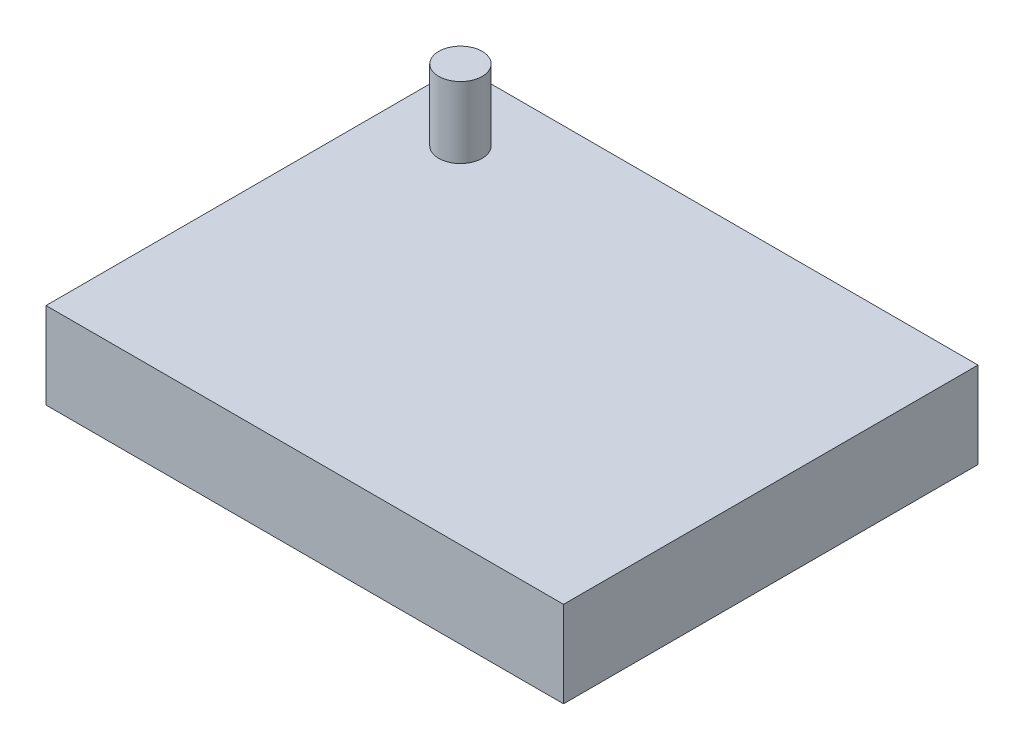
ISO-10303-21;
HEADER;
FILE_DESCRIPTION(('STEP AP214'),'2;1');
FILE_NAME('part.step','',(''),(''),'','','');
FILE_SCHEMA(('AUTOMOTIVE_DESIGN { 1 0 10303 214 1 1 1 1 }'));
ENDSEC;
DATA;
#1=APPLICATION_CONTEXT('core data for automotive mechanical design processes');
#2=APPLICATION_PROTOCOL_DEFINITION('international standard','automotive_design',2000,#1);
#3=PRODUCT_CONTEXT('',#1,'mechanical');
#4=PRODUCT('Part','Part','',(#3));
#5=PRODUCT_RELATED_PRODUCT_CATEGORY('part','',(#4));
#6=PRODUCT_DEFINITION_FORMATION('','',#4);
#7=PRODUCT_DEFINITION_CONTEXT('part definition',#1,'design');
#8=PRODUCT_DEFINITION('design','',#6,#7);
#9=PRODUCT_DEFINITION_SHAPE('','',#8);
#10=(LENGTH_UNIT() NAMED_UNIT(*) SI_UNIT(.MILLI.,.METRE.));
#11=(NAMED_UNIT(*) PLANE_ANGLE_UNIT() SI_UNIT($,.RADIAN.));
#12=(NAMED_UNIT(*) SI_UNIT($,.STERADIAN.) SOLID_ANGLE_UNIT());
#13=UNCERTAINTY_MEASURE_WITH_UNIT(LENGTH_MEASURE(1.E-05),#10,'distance_accuracy_value','');
#14=(GEOMETRIC_REPRESENTATION_CONTEXT(3) GLOBAL_UNCERTAINTY_ASSIGNED_CONTEXT((#13)) GLOBAL_UNIT_ASSIGNED_CONTEXT((#10,
#11,#12)) REPRESENTATION_CONTEXT('',''));
#15=CARTESIAN_POINT('',(0.,0.,0.));
#16=DIRECTION('',(0.,0.,1.));
#17=DIRECTION('',(1.,0.,0.));
#18=AXIS2_PLACEMENT_3D('',#15,#16,#17);
#19=CARTESIAN_POINT('',(-95.3184759122075,31.75,76.3302112377938));
#20=DIRECTION('',(1.,0.,0.));
#21=DIRECTION('',(0.,0.,-1.));
#22=AXIS2_PLACEMENT_3D('',#19,#20,#21);
#23=PLANE('',#22);
#24=DIRECTION('',(0.,0.,1.));
#25=VECTOR('',#24,1.);
#26=CARTESIAN_POINT('',(-95.3184759122075,0.,76.3302112377938));
#27=LINE('',#26,#25);
#28=CARTESIAN_POINT('',(-95.3184759122075,0.,-76.3302112377938));
#29=VERTEX_POINT('',#28);
#30=CARTESIAN_POINT('',(-95.3184759122075,0.,76.3302112377938));
#31=VERTEX_POINT('',#30);
#32=EDGE_CURVE('E103',#29,#31,#27,.T.);
#33=ORIENTED_EDGE('',*,*,#32,.T.);
#34=DIRECTION('',(0.,-1.,0.));
#35=VECTOR('',#34,1.);
#36=CARTESIAN_POINT('',(-95.3184759122075,31.75,76.3302112377938));
#37=LINE('',#36,#35);
#38=CARTESIAN_POINT('',(-95.3184759122075,31.75,76.3302112377938));
#39=VERTEX_POINT('',#38);
#40=EDGE_CURVE('E45',#39,#31,#37,.T.);
#41=ORIENTED_EDGE('',*,*,#40,.F.);
#42=DIRECTION('',(0.,0.,1.));
#43=VECTOR('',#42,1.);
#44=CARTESIAN_POINT('',(-95.3184759122075,31.75,76.3302112377938));
#45=LINE('',#44,#43);
#46=CARTESIAN_POINT('',(-95.3184759122075,31.75,-76.3302112377938));
#47=VERTEX_POINT('',#46);
#48=EDGE_CURVE('E89',#47,#39,#45,.T.);
#49=ORIENTED_EDGE('',*,*,#48,.F.);
#50=DIRECTION('',(0.,-1.,0.));
#51=VECTOR('',#50,1.);
#52=CARTESIAN_POINT('',(-95.3184759122075,31.75,-76.3302112377938));
#53=LINE('',#52,#51);
#54=EDGE_CURVE('E99',#47,#29,#53,.T.);
#55=ORIENTED_EDGE('',*,*,#54,.T.);
#56=EDGE_LOOP('',(#33,#41,#49,#55));
#57=FACE_BOUND('',#56,.T.);
#58=ADVANCED_FACE('F37',(#57),#23,.F.);
#59=CARTESIAN_POINT('',(-95.3184759122075,31.75,76.3302112377938));
#60=DIRECTION('',(0.,0.,-1.));
#61=DIRECTION('',(-1.,0.,0.));
#62=AXIS2_PLACEMENT_3D('',#59,#60,#61);
#63=PLANE('',#62);
#64=DIRECTION('',(1.,0.,0.));
#65=VECTOR('',#64,1.);
#66=CARTESIAN_POINT('',(-95.3184759122075,0.,76.3302112377938));
#67=LINE('',#66,#65);
#68=CARTESIAN_POINT('',(95.3184759122075,0.,76.3302112377938));
#69=VERTEX_POINT('',#68);
#70=EDGE_CURVE('E94',#31,#69,#67,.T.);
#71=ORIENTED_EDGE('',*,*,#70,.T.);
#72=DIRECTION('',(0.,-1.,0.));
#73=VECTOR('',#72,1.);
#74=CARTESIAN_POINT('',(95.3184759122075,31.75,76.3302112377938));
#75=LINE('',#74,#73);
#76=CARTESIAN_POINT('',(95.3184759122075,31.75,76.3302112377938));
#77=VERTEX_POINT('',#76);
#78=EDGE_CURVE('E92',#77,#69,#75,.T.);
#79=ORIENTED_EDGE('',*,*,#78,.F.);
#80=DIRECTION('',(1.,0.,0.));
#81=VECTOR('',#80,1.);
#82=CARTESIAN_POINT('',(-95.3184759122075,31.75,76.3302112377938));
#83=LINE('',#82,#81);
#84=EDGE_CURVE('E84',#39,#77,#83,.T.);
#85=ORIENTED_EDGE('',*,*,#84,.F.);
#86=ORIENTED_EDGE('',*,*,#40,.T.);
#87=EDGE_LOOP('',(#71,#79,#85,#86));
#88=FACE_BOUND('',#87,.T.);
#89=ADVANCED_FACE('F93',(#88),#63,.F.);
#90=CARTESIAN_POINT('',(95.3184759122075,31.75,76.3302112377938));
#91=DIRECTION('',(-1.,0.,0.));
#92=DIRECTION('',(0.,0.,1.));
#93=AXIS2_PLACEMENT_3D('',#90,#91,#92);
#94=PLANE('',#93);
#95=DIRECTION('',(0.,0.,-1.));
#96=VECTOR('',#95,1.);
#97=CARTESIAN_POINT('',(95.3184759122075,0.,76.3302112377938));
#98=LINE('',#97,#96);
#99=CARTESIAN_POINT('',(95.3184759122075,0.,-76.3302112377938));
#100=VERTEX_POINT('',#99);
#101=EDGE_CURVE('E70',#69,#100,#98,.T.);
#102=ORIENTED_EDGE('',*,*,#101,.T.);
#103=DIRECTION('',(0.,-1.,0.));
#104=VECTOR('',#103,1.);
#105=CARTESIAN_POINT('',(95.3184759122075,31.75,-76.3302112377938));
#106=LINE('',#105,#104);
#107=CARTESIAN_POINT('',(95.3184759122075,31.75,-76.3302112377938));
#108=VERTEX_POINT('',#107);
#109=EDGE_CURVE('E95',#108,#100,#106,.T.);
#110=ORIENTED_EDGE('',*,*,#109,.F.);
#111=DIRECTION('',(0.,0.,-1.));
#112=VECTOR('',#111,1.);
#113=CARTESIAN_POINT('',(95.3184759122075,31.75,76.3302112377938));
#114=LINE('',#113,#112);
#115=EDGE_CURVE('E87',#77,#108,#114,.T.);
#116=ORIENTED_EDGE('',*,*,#115,.F.);
#117=ORIENTED_EDGE('',*,*,#78,.T.);
#118=EDGE_LOOP('',(#102,#110,#116,#117));
#119=FACE_BOUND('',#118,.T.);
#120=ADVANCED_FACE('F97',(#119),#94,.F.);
#121=CARTESIAN_POINT('',(-95.3184759122075,31.75,-76.3302112377938));
#122=DIRECTION('',(0.,0.,1.));
#123=DIRECTION('',(1.,0.,0.));
#124=AXIS2_PLACEMENT_3D('',#121,#122,#123);
#125=PLANE('',#124);
#126=DIRECTION('',(-1.,0.,0.));
#127=VECTOR('',#126,1.);
#128=CARTESIAN_POINT('',(-95.3184759122075,0.,-76.3302112377938));
#129=LINE('',#128,#127);
#130=EDGE_CURVE('E76',#100,#29,#129,.T.);
#131=ORIENTED_EDGE('',*,*,#130,.T.);
#132=ORIENTED_EDGE('',*,*,#54,.F.);
#133=DIRECTION('',(-1.,0.,0.));
#134=VECTOR('',#133,1.);
#135=CARTESIAN_POINT('',(-95.3184759122075,31.75,-76.3302112377938));
#136=LINE('',#135,#134);
#137=EDGE_CURVE('E53',#108,#47,#136,.T.);
#138=ORIENTED_EDGE('',*,*,#137,.F.);
#139=ORIENTED_EDGE('',*,*,#109,.T.);
#140=EDGE_LOOP('',(#131,#132,#138,#139));
#141=FACE_BOUND('',#140,.T.);
#142=ADVANCED_FACE('F125',(#141),#125,.F.);
#143=CARTESIAN_POINT('',(0.,31.75,0.));
#144=DIRECTION('',(0.,-1.,0.));
#145=DIRECTION('',(0.,0.,-1.));
#146=AXIS2_PLACEMENT_3D('',#143,#144,#145);
#147=PLANE('',#146);
#148=CARTESIAN_POINT('',(-69.9184759122075,31.75,-50.9302112377938));
#149=DIRECTION('',(0.,-1.,0.));
#150=DIRECTION('',(0.,0.,-1.));
#151=AXIS2_PLACEMENT_3D('',#148,#149,#150);
#152=CIRCLE('',#151,8.001);
#153=CARTESIAN_POINT('',(-69.9184759122075,31.75,-58.9312112377939));
#154=VERTEX_POINT('',#153);
#155=EDGE_CURVE('E11',#154,#154,#152,.F.);
#156=ORIENTED_EDGE('',*,*,#155,.F.);
#157=EDGE_LOOP('',(#156));
#158=FACE_BOUND('',#157,.T.);
#159=ORIENTED_EDGE('',*,*,#48,.T.);
#160=ORIENTED_EDGE('',*,*,#84,.T.);
#161=ORIENTED_EDGE('',*,*,#115,.T.);
#162=ORIENTED_EDGE('',*,*,#137,.T.);
#163=EDGE_LOOP('',(#159,#160,#161,#162));
#164=FACE_BOUND('',#163,.T.);
#165=ADVANCED_FACE('F85',(#158,#164),#147,.F.);
#166=CARTESIAN_POINT('',(0.,0.,0.));
#167=DIRECTION('',(0.,-1.,0.));
#168=DIRECTION('',(0.,0.,-1.));
#169=AXIS2_PLACEMENT_3D('',#166,#167,#168);
#170=PLANE('',#169);
#171=ORIENTED_EDGE('',*,*,#32,.F.);
#172=ORIENTED_EDGE('',*,*,#130,.F.);
#173=ORIENTED_EDGE('',*,*,#101,.F.);
#174=ORIENTED_EDGE('',*,*,#70,.F.);
#175=EDGE_LOOP('',(#171,#172,#173,#174));
#176=FACE_BOUND('',#175,.T.);
#177=ADVANCED_FACE('F114',(#176),#170,.T.);
#178=CARTESIAN_POINT('',(-69.9184759122075,57.912,-50.9302112377938));
#179=DIRECTION('',(0.,-1.,0.));
#180=DIRECTION('',(0.,0.,-1.));
#181=AXIS2_PLACEMENT_3D('',#178,#179,#180);
#182=CYLINDRICAL_SURFACE('',#181,8.001);
#183=CARTESIAN_POINT('',(-69.9184759122075,57.912,-50.9302112377938));
#184=DIRECTION('',(0.,1.,0.));
#185=DIRECTION('',(0.,0.,1.));
#186=AXIS2_PLACEMENT_3D('',#183,#184,#185);
#187=CIRCLE('',#186,8.001);
#188=CARTESIAN_POINT('',(-69.9184759122075,57.912,-58.9312112377939));
#189=VERTEX_POINT('',#188);
#190=EDGE_CURVE('E106',#189,#189,#187,.T.);
#191=CARTESIAN_POINT('',(-69.9184759122075,57.912,-58.9312112377939));
#192=CARTESIAN_POINT('',(-69.9184759122075,57.6394791666667,-58.9312112377939));
#193=CARTESIAN_POINT('',(-69.9184759122075,57.3669583333333,-58.9312112377939));
#194=CARTESIAN_POINT('',(-69.9184759122075,56.8219166666667,-58.9312112377939));
#195=CARTESIAN_POINT('',(-69.9184759122075,56.5493958333333,-58.9312112377939));
#196=CARTESIAN_POINT('',(-69.9184759122075,56.0043541666667,-58.9312112377939));
#197=CARTESIAN_POINT('',(-69.9184759122075,55.7318333333333,-58.9312112377939));
#198=CARTESIAN_POINT('',(-69.9184759122075,55.1867916666667,-58.9312112377939));
#199=CARTESIAN_POINT('',(-69.9184759122075,54.9142708333333,-58.9312112377939));
#200=CARTESIAN_POINT('',(-69.9184759122075,54.3692291666667,-58.9312112377939));
#201=CARTESIAN_POINT('',(-69.9184759122075,54.0967083333333,-58.9312112377939));
#202=CARTESIAN_POINT('',(-69.9184759122075,53.5516666666667,-58.9312112377939));
#203=CARTESIAN_POINT('',(-69.9184759122075,53.2791458333333,-58.9312112377939));
#204=CARTESIAN_POINT('',(-69.9184759122075,52.7341041666667,-58.9312112377939));
#205=CARTESIAN_POINT('',(-69.9184759122075,52.4615833333333,-58.9312112377939));
#206=CARTESIAN_POINT('',(-69.9184759122075,51.9165416666667,-58.9312112377939));
#207=CARTESIAN_POINT('',(-69.9184759122075,51.6440208333333,-58.9312112377939));
#208=CARTESIAN_POINT('',(-69.9184759122075,51.0989791666667,-58.9312112377939));
#209=CARTESIAN_POINT('',(-69.9184759122075,50.8264583333333,-58.9312112377939));
#210=CARTESIAN_POINT('',(-69.9184759122075,50.2814166666667,-58.9312112377939));
#211=CARTESIAN_POINT('',(-69.9184759122075,50.0088958333333,-58.9312112377939));
#212=CARTESIAN_POINT('',(-69.9184759122075,49.4638541666667,-58.9312112377939));
#213=CARTESIAN_POINT('',(-69.9184759122075,49.1913333333333,-58.9312112377939));
#214=CARTESIAN_POINT('',(-69.9184759122075,48.6462916666667,-58.9312112377939));
#215=CARTESIAN_POINT('',(-69.9184759122075,48.3737708333333,-58.9312112377939));
#216=CARTESIAN_POINT('',(-69.9184759122075,47.8287291666667,-58.9312112377939));
#217=CARTESIAN_POINT('',(-69.9184759122075,47.5562083333333,-58.9312112377939));
#218=CARTESIAN_POINT('',(-69.9184759122075,47.0111666666667,-58.9312112377939));
#219=CARTESIAN_POINT('',(-69.9184759122075,46.7386458333333,-58.9312112377939));
#220=CARTESIAN_POINT('',(-69.9184759122075,46.1936041666667,-58.9312112377939));
#221=CARTESIAN_POINT('',(-69.9184759122075,45.9210833333333,-58.9312112377939));
#222=CARTESIAN_POINT('',(-69.9184759122075,45.3760416666667,-58.9312112377939));
#223=CARTESIAN_POINT('',(-69.9184759122075,45.1035208333333,-58.9312112377939));
#224=CARTESIAN_POINT('',(-69.9184759122075,44.5584791666667,-58.9312112377939));
#225=CARTESIAN_POINT('',(-69.9184759122075,44.2859583333333,-58.9312112377939));
#226=CARTESIAN_POINT('',(-69.9184759122075,43.7409166666667,-58.9312112377939));
#227=CARTESIAN_POINT('',(-69.9184759122075,43.4683958333333,-58.9312112377939));
#228=CARTESIAN_POINT('',(-69.9184759122075,42.9233541666667,-58.9312112377939));
#229=CARTESIAN_POINT('',(-69.9184759122075,42.6508333333333,-58.9312112377939));
#230=CARTESIAN_POINT('',(-69.9184759122075,42.1057916666667,-58.9312112377939));
#231=CARTESIAN_POINT('',(-69.9184759122075,41.8332708333333,-58.9312112377939));
#232=CARTESIAN_POINT('',(-69.9184759122075,41.2882291666667,-58.9312112377939));
#233=CARTESIAN_POINT('',(-69.9184759122075,41.0157083333333,-58.9312112377939));
#234=CARTESIAN_POINT('',(-69.9184759122075,40.4706666666667,-58.9312112377939));
#235=CARTESIAN_POINT('',(-69.9184759122075,40.1981458333333,-58.9312112377939));
#236=CARTESIAN_POINT('',(-69.9184759122075,39.6531041666667,-58.9312112377939));
#237=CARTESIAN_POINT('',(-69.9184759122075,39.3805833333333,-58.9312112377939));
#238=CARTESIAN_POINT('',(-69.9184759122075,38.8355416666667,-58.9312112377939));
#239=CARTESIAN_POINT('',(-69.9184759122075,38.5630208333333,-58.9312112377939));
#240=CARTESIAN_POINT('',(-69.9184759122075,38.0179791666667,-58.9312112377939));
#241=CARTESIAN_POINT('',(-69.9184759122075,37.7454583333333,-58.9312112377939));
#242=CARTESIAN_POINT('',(-69.9184759122075,37.2004166666667,-58.9312112377939));
#243=CARTESIAN_POINT('',(-69.9184759122075,36.9278958333333,-58.9312112377939));
#244=CARTESIAN_POINT('',(-69.9184759122075,36.3828541666667,-58.9312112377939));
#245=CARTESIAN_POINT('',(-69.9184759122075,36.1103333333333,-58.9312112377939));
#246=CARTESIAN_POINT('',(-69.9184759122075,35.5652916666667,-58.9312112377939));
#247=CARTESIAN_POINT('',(-69.9184759122075,35.2927708333333,-58.9312112377939));
#248=CARTESIAN_POINT('',(-69.9184759122075,34.7477291666667,-58.9312112377939));
#249=CARTESIAN_POINT('',(-69.9184759122075,34.4752083333333,-58.9312112377939));
#250=CARTESIAN_POINT('',(-69.9184759122075,33.9301666666667,-58.9312112377939));
#251=CARTESIAN_POINT('',(-69.9184759122075,33.6576458333333,-58.9312112377939));
#252=CARTESIAN_POINT('',(-69.9184759122075,33.1126041666667,-58.9312112377939));
#253=CARTESIAN_POINT('',(-69.9184759122075,32.8400833333333,-58.9312112377939));
#254=CARTESIAN_POINT('',(-69.9184759122075,32.2950416666667,-58.9312112377939));
#255=CARTESIAN_POINT('',(-69.9184759122075,32.0225208333333,-58.9312112377939));
#256=CARTESIAN_POINT('',(-69.9184759122075,31.75,-58.9312112377939));
#257=B_SPLINE_CURVE_WITH_KNOTS('',3,(#191,#192,#193,#194,#195,#196,#197,#198,#199,#200,#201,
#202,#203,#204,#205,#206,#207,#208,#209,#210,#211,#212,#213,#214,#215,#216,#217,#218,#219,#220,
#221,#222,#223,#224,#225,#226,#227,#228,#229,#230,#231,#232,#233,#234,#235,#236,#237,#238,#239,
#240,#241,#242,#243,#244,#245,#246,#247,#248,#249,#250,#251,#252,#253,#254,#255,#256),
.UNSPECIFIED.,.F.,.F.,(4,2,2,2,2,2,2,2,2,2,2,2,2,2,2,2,2,2,2,2,2,2,2,2,2,2,2,2,2,2,2,2,4),(0.,
0.817562500000001,1.635125,2.4526875,3.27025,4.0878125,4.905375,5.7229375,6.54050000000001,
7.35806250000001,8.17562500000001,8.9931875,9.81075,10.6283125,11.445875,12.2634375,13.081,
13.8985625,14.716125,15.5336875,16.35125,17.1688125,17.986375,18.8039375,19.6215,20.4390625,
21.256625,22.0741875,22.89175,23.7093125,24.526875,25.3444375,26.162),.UNSPECIFIED.);
#258=EDGE_CURVE('BSEAM116',#189,#154,#257,.T.);
#259=ORIENTED_EDGE('',*,*,#190,.F.);
#260=ORIENTED_EDGE('',*,*,#155,.T.);
#261=ORIENTED_EDGE('',*,*,#258,.T.);
#262=ORIENTED_EDGE('',*,*,#258,.F.);
#263=EDGE_LOOP('',(#259,#261,#260,#262));
#264=FACE_BOUND('',#263,.T.);
#265=ADVANCED_FACE('F116',(#264),#182,.T.);
#266=CARTESIAN_POINT('',(-69.9184759122075,57.912,-50.9302112377938));
#267=DIRECTION('',(0.,1.,0.));
#268=DIRECTION('',(0.,0.,1.));
#269=AXIS2_PLACEMENT_3D('',#266,#267,#268);
#270=PLANE('',#269);
#271=ORIENTED_EDGE('',*,*,#190,.T.);
#272=EDGE_LOOP('',(#271));
#273=FACE_BOUND('',#272,.T.);
#274=ADVANCED_FACE('F122',(#273),#270,.T.);
#275=CLOSED_SHELL('',(#58,#89,#120,#142,#165,#177,#265,#274));
#276=MANIFOLD_SOLID_BREP('B2',#275);
#277=ADVANCED_BREP_SHAPE_REPRESENTATION('',(#18,#276),#14);
#278=SHAPE_DEFINITION_REPRESENTATION(#9,#277);
ENDSEC;
END-ISO-10303-21;
